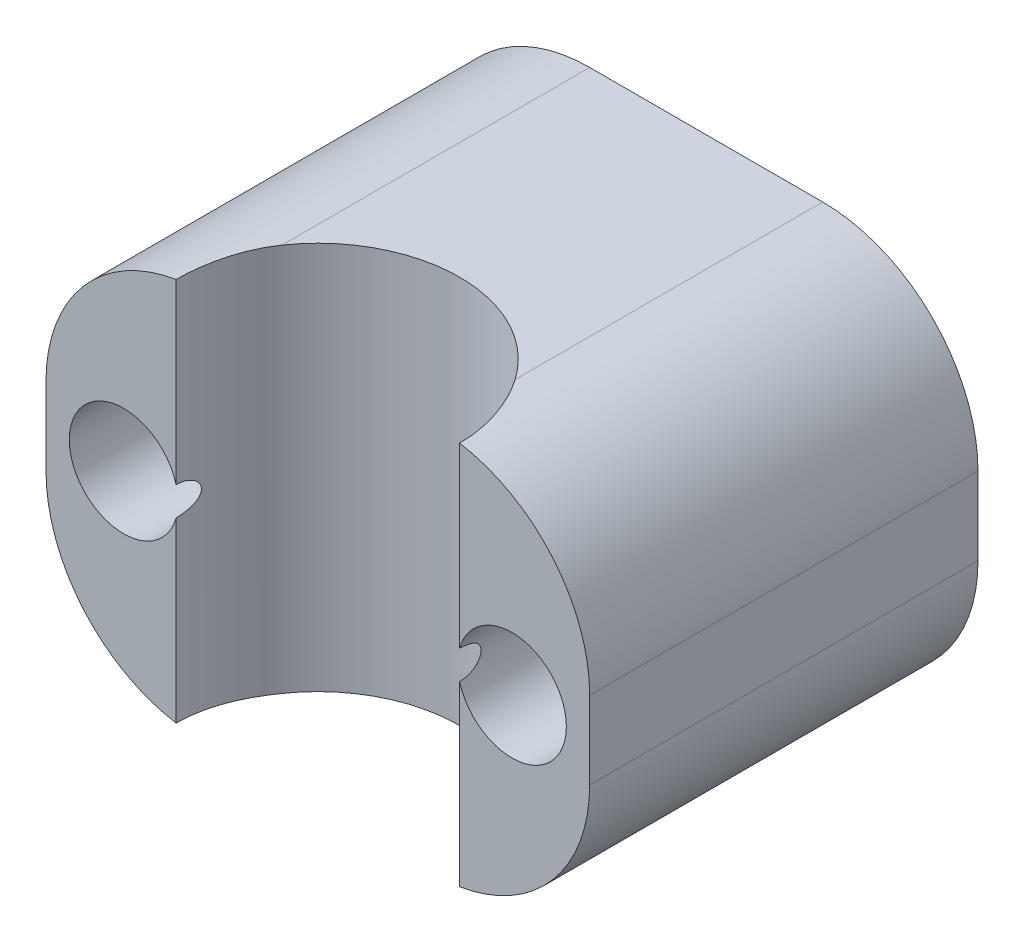
ISO-10303-21;
HEADER;
FILE_DESCRIPTION(('STEP AP214'),'2;1');
FILE_NAME('part.step','',(''),(''),'','','');
FILE_SCHEMA(('AUTOMOTIVE_DESIGN { 1 0 10303 214 1 1 1 1 }'));
ENDSEC;
DATA;
#1=APPLICATION_CONTEXT('core data for automotive mechanical design processes');
#2=APPLICATION_PROTOCOL_DEFINITION('international standard','automotive_design',2000,#1);
#3=PRODUCT_CONTEXT('',#1,'mechanical');
#4=PRODUCT('Part','Part','',(#3));
#5=PRODUCT_RELATED_PRODUCT_CATEGORY('part','',(#4));
#6=PRODUCT_DEFINITION_FORMATION('','',#4);
#7=PRODUCT_DEFINITION_CONTEXT('part definition',#1,'design');
#8=PRODUCT_DEFINITION('design','',#6,#7);
#9=PRODUCT_DEFINITION_SHAPE('','',#8);
#10=(LENGTH_UNIT() NAMED_UNIT(*) SI_UNIT(.MILLI.,.METRE.));
#11=(NAMED_UNIT(*) PLANE_ANGLE_UNIT() SI_UNIT($,.RADIAN.));
#12=(NAMED_UNIT(*) SI_UNIT($,.STERADIAN.) SOLID_ANGLE_UNIT());
#13=UNCERTAINTY_MEASURE_WITH_UNIT(LENGTH_MEASURE(1.E-05),#10,'distance_accuracy_value','');
#14=(GEOMETRIC_REPRESENTATION_CONTEXT(3) GLOBAL_UNCERTAINTY_ASSIGNED_CONTEXT((#13)) GLOBAL_UNIT_ASSIGNED_CONTEXT((#10,
#11,#12)) REPRESENTATION_CONTEXT('',''));
#15=CARTESIAN_POINT('',(0.,0.,0.));
#16=DIRECTION('',(0.,0.,1.));
#17=DIRECTION('',(1.,0.,0.));
#18=AXIS2_PLACEMENT_3D('',#15,#16,#17);
#19=CARTESIAN_POINT('',(3.,-0.999999999999999,10.));
#20=DIRECTION('',(0.,0.,1.));
#21=DIRECTION('',(1.,0.,0.));
#22=AXIS2_PLACEMENT_3D('',#19,#20,#21);
#23=PLANE('',#22);
#24=CARTESIAN_POINT('',(5.,0.,10.));
#25=DIRECTION('',(0.,0.,1.));
#26=DIRECTION('',(1.,0.,0.));
#27=AXIS2_PLACEMENT_3D('',#24,#25,#26);
#28=CIRCLE('',#27,1.4);
#29=CARTESIAN_POINT('',(3.65,-0.370809924354783,10.));
#30=VERTEX_POINT('',#29);
#31=CARTESIAN_POINT('',(3.65,0.370809924354787,10.));
#32=VERTEX_POINT('',#31);
#33=EDGE_CURVE('E47',#30,#32,#28,.T.);
#34=ORIENTED_EDGE('',*,*,#33,.F.);
#35=DIRECTION('',(0.,1.,0.));
#36=VECTOR('',#35,1.);
#37=CARTESIAN_POINT('',(3.65,-5.001,10.));
#38=LINE('',#37,#36);
#39=CARTESIAN_POINT('',(3.65,-4.94683417437318,10.));
#40=VERTEX_POINT('',#39);
#41=EDGE_CURVE('E140',#30,#40,#38,.F.);
#42=ORIENTED_EDGE('',*,*,#41,.T.);
#43=CARTESIAN_POINT('',(3.,-0.999999999999999,10.));
#44=DIRECTION('',(0.,0.,1.));
#45=DIRECTION('',(1.,0.,0.));
#46=AXIS2_PLACEMENT_3D('',#43,#44,#45);
#47=CIRCLE('',#46,4.);
#48=CARTESIAN_POINT('',(7.,-0.999999999999999,10.));
#49=VERTEX_POINT('',#48);
#50=EDGE_CURVE('E184',#40,#49,#47,.T.);
#51=ORIENTED_EDGE('',*,*,#50,.T.);
#52=DIRECTION('',(0.,1.,0.));
#53=VECTOR('',#52,1.);
#54=CARTESIAN_POINT('',(7.,1.,10.));
#55=LINE('',#54,#53);
#56=CARTESIAN_POINT('',(7.,1.,10.));
#57=VERTEX_POINT('',#56);
#58=EDGE_CURVE('E186',#49,#57,#55,.T.);
#59=ORIENTED_EDGE('',*,*,#58,.T.);
#60=CARTESIAN_POINT('',(3.,1.,10.));
#61=DIRECTION('',(0.,0.,1.));
#62=DIRECTION('',(-1.,0.,0.));
#63=AXIS2_PLACEMENT_3D('',#60,#61,#62);
#64=CIRCLE('',#63,4.);
#65=CARTESIAN_POINT('',(3.65,4.94683417437318,10.));
#66=VERTEX_POINT('',#65);
#67=EDGE_CURVE('E189',#57,#66,#64,.T.);
#68=ORIENTED_EDGE('',*,*,#67,.T.);
#69=EDGE_CURVE('E146',#66,#32,#38,.F.);
#70=ORIENTED_EDGE('',*,*,#69,.T.);
#71=EDGE_LOOP('',(#34,#42,#51,#59,#68,#70));
#72=FACE_BOUND('',#71,.T.);
#73=ADVANCED_FACE('F33',(#72),#23,.T.);
#74=CARTESIAN_POINT('',(3.,-0.999999999999999,10.));
#75=DIRECTION('',(0.,0.,-1.));
#76=DIRECTION('',(-1.,0.,0.));
#77=AXIS2_PLACEMENT_3D('',#74,#75,#76);
#78=CYLINDRICAL_SURFACE('',#77,4.);
#79=ORIENTED_EDGE('',*,*,#50,.F.);
#80=CARTESIAN_POINT('',(3.,-5.,7.92093771137082));
#81=CARTESIAN_POINT('',(3.05905614962708,-4.99998590221366,8.00613249850465));
#82=CARTESIAN_POINT('',(3.11445377091346,-4.99869143231913,8.09384145310506));
#83=CARTESIAN_POINT('',(3.217577286826,-4.99441530970738,8.27361361424878));
#84=CARTESIAN_POINT('',(3.26530379211801,-4.99143379137462,8.36567647343987));
#85=CARTESIAN_POINT('',(3.35165363879588,-4.98474104788839,8.55116271649373));
#86=CARTESIAN_POINT('',(3.39047370499135,-4.98104979493619,8.64449545508971));
#87=CARTESIAN_POINT('',(3.46023776477938,-4.97358973161619,8.83404616543743));
#88=CARTESIAN_POINT('',(3.49118300508242,-4.96982093362724,8.930263677784));
#89=CARTESIAN_POINT('',(3.53971247846784,-4.96348127563908,9.10583715892558));
#90=CARTESIAN_POINT('',(3.55872688830118,-4.96082045033227,9.18479809180945));
#91=CARTESIAN_POINT('',(3.59145062058653,-4.95606603985459,9.34382106297566));
#92=CARTESIAN_POINT('',(3.60516066552437,-4.95397237744445,9.42388294976217));
#93=CARTESIAN_POINT('',(3.62743675264427,-4.95050129027259,9.58640131586605));
#94=CARTESIAN_POINT('',(3.63589208443823,-4.94913935749735,9.66887331603807));
#95=CARTESIAN_POINT('',(3.64717686274494,-4.94729870459661,9.83422959665278));
#96=CARTESIAN_POINT('',(3.65000503629541,-4.94682018431634,9.91711396613044));
#97=CARTESIAN_POINT('',(3.65,-4.94683417437318,10.));
#98=B_SPLINE_CURVE_WITH_KNOTS('',3,(#80,#81,#82,#83,#84,#85,#86,#87,#88,#89,#90,#91,#92,#93,#94,
#95,#96,#97),.UNSPECIFIED.,.F.,.F.,(4,2,2,2,2,2,2,2,4),(0.,0.310860241223388,0.621695723878272,
0.924807712383898,1.22787168353305,1.47148275049163,1.7150606244922,1.9636103552711,
2.21221630598534),.UNSPECIFIED.);
#99=CARTESIAN_POINT('',(3.,-5.,7.92093771137082));
#100=VERTEX_POINT('',#99);
#101=EDGE_CURVE('E173',#100,#40,#98,.T.);
#102=ORIENTED_EDGE('',*,*,#101,.F.);
#103=DIRECTION('',(0.,0.,-1.));
#104=VECTOR('',#103,1.);
#105=CARTESIAN_POINT('',(3.,-5.,10.));
#106=LINE('',#105,#104);
#107=CARTESIAN_POINT('',(3.,-5.,0.));
#108=VERTEX_POINT('',#107);
#109=EDGE_CURVE('E198',#100,#108,#106,.T.);
#110=ORIENTED_EDGE('',*,*,#109,.T.);
#111=CARTESIAN_POINT('',(3.,-0.999999999999999,0.));
#112=DIRECTION('',(0.,0.,1.));
#113=DIRECTION('',(1.,0.,0.));
#114=AXIS2_PLACEMENT_3D('',#111,#112,#113);
#115=CIRCLE('',#114,4.);
#116=CARTESIAN_POINT('',(7.,-0.999999999999999,0.));
#117=VERTEX_POINT('',#116);
#118=EDGE_CURVE('E181',#108,#117,#115,.T.);
#119=ORIENTED_EDGE('',*,*,#118,.T.);
#120=DIRECTION('',(0.,0.,-1.));
#121=VECTOR('',#120,1.);
#122=CARTESIAN_POINT('',(7.,-0.999999999999999,10.));
#123=LINE('',#122,#121);
#124=EDGE_CURVE('E11',#49,#117,#123,.T.);
#125=ORIENTED_EDGE('',*,*,#124,.F.);
#126=EDGE_LOOP('',(#79,#102,#110,#119,#125));
#127=FACE_BOUND('',#126,.T.);
#128=ADVANCED_FACE('F35',(#127),#78,.T.);
#129=CARTESIAN_POINT('',(7.,1.,10.));
#130=DIRECTION('',(-1.,0.,0.));
#131=DIRECTION('',(0.,0.,1.));
#132=AXIS2_PLACEMENT_3D('',#129,#130,#131);
#133=PLANE('',#132);
#134=DIRECTION('',(0.,1.,0.));
#135=VECTOR('',#134,1.);
#136=CARTESIAN_POINT('',(7.,1.,0.));
#137=LINE('',#136,#135);
#138=CARTESIAN_POINT('',(7.,1.,0.));
#139=VERTEX_POINT('',#138);
#140=EDGE_CURVE('E201',#117,#139,#137,.T.);
#141=ORIENTED_EDGE('',*,*,#140,.T.);
#142=DIRECTION('',(0.,0.,-1.));
#143=VECTOR('',#142,1.);
#144=CARTESIAN_POINT('',(7.,1.,10.));
#145=LINE('',#144,#143);
#146=EDGE_CURVE('E41',#57,#139,#145,.T.);
#147=ORIENTED_EDGE('',*,*,#146,.F.);
#148=ORIENTED_EDGE('',*,*,#58,.F.);
#149=ORIENTED_EDGE('',*,*,#124,.T.);
#150=EDGE_LOOP('',(#141,#147,#148,#149));
#151=FACE_BOUND('',#150,.T.);
#152=ADVANCED_FACE('F254',(#151),#133,.F.);
#153=CARTESIAN_POINT('',(3.,1.,10.));
#154=DIRECTION('',(0.,0.,-1.));
#155=DIRECTION('',(-1.,0.,0.));
#156=AXIS2_PLACEMENT_3D('',#153,#154,#155);
#157=CYLINDRICAL_SURFACE('',#156,4.);
#158=DIRECTION('',(0.,0.,-1.));
#159=VECTOR('',#158,1.);
#160=CARTESIAN_POINT('',(3.,5.,10.));
#161=LINE('',#160,#159);
#162=CARTESIAN_POINT('',(3.,5.,7.92093771137082));
#163=VERTEX_POINT('',#162);
#164=CARTESIAN_POINT('',(3.,5.,0.));
#165=VERTEX_POINT('',#164);
#166=EDGE_CURVE('E229',#163,#165,#161,.T.);
#167=ORIENTED_EDGE('',*,*,#166,.F.);
#168=CARTESIAN_POINT('',(3.65,4.94683417437318,10.));
#169=CARTESIAN_POINT('',(3.65001149307545,4.94680039843344,9.89629118581616));
#170=CARTESIAN_POINT('',(3.6455801855096,4.94756117960404,9.79258915088072));
#171=CARTESIAN_POINT('',(3.62791967941891,4.9504257845458,9.58596115882356));
#172=CARTESIAN_POINT('',(3.61469101588359,4.95252952664778,9.48303515489434));
#173=CARTESIAN_POINT('',(3.57995927449505,4.95776830554319,9.281240900948));
#174=CARTESIAN_POINT('',(3.55866939038773,4.96087649114836,9.182335304927));
#175=CARTESIAN_POINT('',(3.50797901199628,4.96769596494514,8.98668671751548));
#176=CARTESIAN_POINT('',(3.47857973547122,4.97140716255019,8.88994340377873));
#177=CARTESIAN_POINT('',(3.39163438290355,4.98114952363938,8.64148266725141));
#178=CARTESIAN_POINT('',(3.32781699127362,4.9872268619832,8.49188815799929));
#179=CARTESIAN_POINT('',(3.21689120655757,4.99429035551251,8.27344656372807));
#180=CARTESIAN_POINT('',(3.17689705748746,4.99631241481261,8.20092086026241));
#181=CARTESIAN_POINT('',(3.09204983560424,4.99916553007525,8.05871754655031));
#182=CARTESIAN_POINT('',(3.04719533596757,4.99999623527487,7.98904078096244));
#183=CARTESIAN_POINT('',(3.,5.,7.92093771137082));
#184=B_SPLINE_CURVE_WITH_KNOTS('',3,(#168,#169,#170,#171,#172,#173,#174,#175,#176,#177,#178,
#179,#180,#181,#182,#183),.UNSPECIFIED.,.F.,.F.,(4,2,2,2,2,2,2,4),(0.,0.311017870391577,
0.622016828727295,0.92530816303992,1.22855397792626,1.71512556766894,1.96349912819243,
2.21194580078801),.UNSPECIFIED.);
#185=EDGE_CURVE('E156',#66,#163,#184,.T.);
#186=ORIENTED_EDGE('',*,*,#185,.F.);
#187=ORIENTED_EDGE('',*,*,#67,.F.);
#188=ORIENTED_EDGE('',*,*,#146,.T.);
#189=CARTESIAN_POINT('',(3.,1.,0.));
#190=DIRECTION('',(0.,0.,1.));
#191=DIRECTION('',(-1.,0.,0.));
#192=AXIS2_PLACEMENT_3D('',#189,#190,#191);
#193=CIRCLE('',#192,4.);
#194=EDGE_CURVE('E203',#139,#165,#193,.T.);
#195=ORIENTED_EDGE('',*,*,#194,.T.);
#196=EDGE_LOOP('',(#167,#186,#187,#188,#195));
#197=FACE_BOUND('',#196,.T.);
#198=ADVANCED_FACE('F236',(#197),#157,.T.);
#199=CARTESIAN_POINT('',(-3.,5.,10.));
#200=DIRECTION('',(0.,-1.,0.));
#201=DIRECTION('',(0.,0.,-1.));
#202=AXIS2_PLACEMENT_3D('',#199,#200,#201);
#203=PLANE('',#202);
#204=DIRECTION('',(0.,0.,-1.));
#205=VECTOR('',#204,1.);
#206=CARTESIAN_POINT('',(-3.,5.,10.));
#207=LINE('',#206,#205);
#208=CARTESIAN_POINT('',(-3.,5.,7.92093771137082));
#209=VERTEX_POINT('',#208);
#210=CARTESIAN_POINT('',(-3.,5.,0.));
#211=VERTEX_POINT('',#210);
#212=EDGE_CURVE('E227',#209,#211,#207,.T.);
#213=ORIENTED_EDGE('',*,*,#212,.F.);
#214=CARTESIAN_POINT('',(0.,5.,10.));
#215=DIRECTION('',(0.,1.,0.));
#216=DIRECTION('',(0.,0.,1.));
#217=AXIS2_PLACEMENT_3D('',#214,#215,#216);
#218=CIRCLE('',#217,3.65);
#219=EDGE_CURVE('E250',#163,#209,#218,.T.);
#220=ORIENTED_EDGE('',*,*,#219,.F.);
#221=ORIENTED_EDGE('',*,*,#166,.T.);
#222=DIRECTION('',(-1.,0.,0.));
#223=VECTOR('',#222,1.);
#224=CARTESIAN_POINT('',(-3.,5.,0.));
#225=LINE('',#224,#223);
#226=EDGE_CURVE('E206',#165,#211,#225,.T.);
#227=ORIENTED_EDGE('',*,*,#226,.T.);
#228=EDGE_LOOP('',(#213,#220,#221,#227));
#229=FACE_BOUND('',#228,.T.);
#230=ADVANCED_FACE('F248',(#229),#203,.F.);
#231=CARTESIAN_POINT('',(-3.,1.,10.));
#232=DIRECTION('',(0.,0.,-1.));
#233=DIRECTION('',(-1.,0.,0.));
#234=AXIS2_PLACEMENT_3D('',#231,#232,#233);
#235=CYLINDRICAL_SURFACE('',#234,4.);
#236=CARTESIAN_POINT('',(-3.,1.,10.));
#237=DIRECTION('',(0.,0.,1.));
#238=DIRECTION('',(1.,0.,0.));
#239=AXIS2_PLACEMENT_3D('',#236,#237,#238);
#240=CIRCLE('',#239,4.);
#241=CARTESIAN_POINT('',(-3.65,4.94683417437318,10.));
#242=VERTEX_POINT('',#241);
#243=CARTESIAN_POINT('',(-7.,1.,10.));
#244=VERTEX_POINT('',#243);
#245=EDGE_CURVE('E192',#242,#244,#240,.T.);
#246=ORIENTED_EDGE('',*,*,#245,.F.);
#247=CARTESIAN_POINT('',(-3.,5.,7.92093771137082));
#248=CARTESIAN_POINT('',(-3.05905614962708,4.99998590221366,8.00613249850465));
#249=CARTESIAN_POINT('',(-3.11445377091346,4.99869143231913,8.09384145310506));
#250=CARTESIAN_POINT('',(-3.217577286826,4.99441530970739,8.27361361424878));
#251=CARTESIAN_POINT('',(-3.26530379211801,4.99143379137462,8.36567647343986));
#252=CARTESIAN_POINT('',(-3.35165363879588,4.98474104788839,8.55116271649373));
#253=CARTESIAN_POINT('',(-3.39047370499135,4.98104979493619,8.6444954550897));
#254=CARTESIAN_POINT('',(-3.46023776477938,4.97358973161619,8.83404616543743));
#255=CARTESIAN_POINT('',(-3.49118300508242,4.96982093362724,8.930263677784));
#256=CARTESIAN_POINT('',(-3.53971247846784,4.96348127563909,9.10583715892557));
#257=CARTESIAN_POINT('',(-3.55872688830118,4.96082045033227,9.18479809180945));
#258=CARTESIAN_POINT('',(-3.59145062058653,4.95606603985459,9.34382106297566));
#259=CARTESIAN_POINT('',(-3.60516066552437,4.95397237744445,9.42388294976217));
#260=CARTESIAN_POINT('',(-3.62743675264427,4.9505012902726,9.58640131586605));
#261=CARTESIAN_POINT('',(-3.63589208443823,4.94913935749735,9.66887331603806));
#262=CARTESIAN_POINT('',(-3.64717686274494,4.94729870459661,9.83422959665278));
#263=CARTESIAN_POINT('',(-3.65000503629541,4.94682018431635,9.91711396613044));
#264=CARTESIAN_POINT('',(-3.65,4.94683417437318,10.));
#265=B_SPLINE_CURVE_WITH_KNOTS('',3,(#247,#248,#249,#250,#251,#252,#253,#254,#255,#256,#257,
#258,#259,#260,#261,#262,#263,#264),.UNSPECIFIED.,.F.,.F.,(4,2,2,2,2,2,2,2,4),(0.,
0.310860241223388,0.62169572387827,0.924807712383896,1.22787168353305,1.47148275049163,
1.7150606244922,1.9636103552711,2.21221630598534),.UNSPECIFIED.);
#266=EDGE_CURVE('E137',#209,#242,#265,.T.);
#267=ORIENTED_EDGE('',*,*,#266,.F.);
#268=ORIENTED_EDGE('',*,*,#212,.T.);
#269=CARTESIAN_POINT('',(-3.,1.,0.));
#270=DIRECTION('',(0.,0.,1.));
#271=DIRECTION('',(1.,0.,0.));
#272=AXIS2_PLACEMENT_3D('',#269,#270,#271);
#273=CIRCLE('',#272,4.);
#274=CARTESIAN_POINT('',(-7.,1.,0.));
#275=VERTEX_POINT('',#274);
#276=EDGE_CURVE('E209',#211,#275,#273,.T.);
#277=ORIENTED_EDGE('',*,*,#276,.T.);
#278=DIRECTION('',(0.,0.,-1.));
#279=VECTOR('',#278,1.);
#280=CARTESIAN_POINT('',(-7.,1.,10.));
#281=LINE('',#280,#279);
#282=EDGE_CURVE('E224',#244,#275,#281,.T.);
#283=ORIENTED_EDGE('',*,*,#282,.F.);
#284=EDGE_LOOP('',(#246,#267,#268,#277,#283));
#285=FACE_BOUND('',#284,.T.);
#286=ADVANCED_FACE('F274',(#285),#235,.T.);
#287=CARTESIAN_POINT('',(-7.,1.,10.));
#288=DIRECTION('',(1.,0.,0.));
#289=DIRECTION('',(0.,1.,0.));
#290=AXIS2_PLACEMENT_3D('',#287,#288,#289);
#291=PLANE('',#290);
#292=DIRECTION('',(0.,-1.,0.));
#293=VECTOR('',#292,1.);
#294=CARTESIAN_POINT('',(-7.,1.,0.));
#295=LINE('',#294,#293);
#296=CARTESIAN_POINT('',(-7.,-0.999999999999999,0.));
#297=VERTEX_POINT('',#296);
#298=EDGE_CURVE('E211',#275,#297,#295,.T.);
#299=ORIENTED_EDGE('',*,*,#298,.T.);
#300=DIRECTION('',(0.,0.,-1.));
#301=VECTOR('',#300,1.);
#302=CARTESIAN_POINT('',(-7.,-0.999999999999999,10.));
#303=LINE('',#302,#301);
#304=CARTESIAN_POINT('',(-7.,-0.999999999999999,10.));
#305=VERTEX_POINT('',#304);
#306=EDGE_CURVE('E221',#305,#297,#303,.T.);
#307=ORIENTED_EDGE('',*,*,#306,.F.);
#308=DIRECTION('',(0.,-1.,0.));
#309=VECTOR('',#308,1.);
#310=CARTESIAN_POINT('',(-7.,1.,10.));
#311=LINE('',#310,#309);
#312=EDGE_CURVE('E194',#244,#305,#311,.T.);
#313=ORIENTED_EDGE('',*,*,#312,.F.);
#314=ORIENTED_EDGE('',*,*,#282,.T.);
#315=EDGE_LOOP('',(#299,#307,#313,#314));
#316=FACE_BOUND('',#315,.T.);
#317=ADVANCED_FACE('F271',(#316),#291,.F.);
#318=CARTESIAN_POINT('',(-3.,-0.999999999999999,10.));
#319=DIRECTION('',(0.,0.,-1.));
#320=DIRECTION('',(-1.,0.,0.));
#321=AXIS2_PLACEMENT_3D('',#318,#319,#320);
#322=CYLINDRICAL_SURFACE('',#321,4.);
#323=DIRECTION('',(0.,0.,-1.));
#324=VECTOR('',#323,1.);
#325=CARTESIAN_POINT('',(-3.,-5.,10.));
#326=LINE('',#325,#324);
#327=CARTESIAN_POINT('',(-3.,-5.,7.92093771137082));
#328=VERTEX_POINT('',#327);
#329=CARTESIAN_POINT('',(-3.,-5.,0.));
#330=VERTEX_POINT('',#329);
#331=EDGE_CURVE('E219',#328,#330,#326,.T.);
#332=ORIENTED_EDGE('',*,*,#331,.F.);
#333=CARTESIAN_POINT('',(-3.65,-4.94683417437318,10.));
#334=CARTESIAN_POINT('',(-3.65001149307545,-4.94680039843344,9.89629118581616));
#335=CARTESIAN_POINT('',(-3.6455801855096,-4.94756117960404,9.79258915088072));
#336=CARTESIAN_POINT('',(-3.62791967941891,-4.9504257845458,9.58596115882356));
#337=CARTESIAN_POINT('',(-3.61469101588359,-4.95252952664778,9.48303515489434));
#338=CARTESIAN_POINT('',(-3.57995927449505,-4.95776830554319,9.281240900948));
#339=CARTESIAN_POINT('',(-3.55866939038773,-4.96087649114836,9.182335304927));
#340=CARTESIAN_POINT('',(-3.50797901199628,-4.96769596494513,8.98668671751548));
#341=CARTESIAN_POINT('',(-3.47857973547122,-4.97140716255019,8.88994340377873));
#342=CARTESIAN_POINT('',(-3.39163438290355,-4.98114952363938,8.64148266725141));
#343=CARTESIAN_POINT('',(-3.32781699127362,-4.9872268619832,8.49188815799929));
#344=CARTESIAN_POINT('',(-3.21689120655757,-4.99429035551251,8.27344656372807));
#345=CARTESIAN_POINT('',(-3.17689705748746,-4.99631241481261,8.20092086026241));
#346=CARTESIAN_POINT('',(-3.09204983560424,-4.99916553007525,8.05871754655031));
#347=CARTESIAN_POINT('',(-3.04719533596757,-4.99999623527486,7.98904078096244));
#348=CARTESIAN_POINT('',(-3.,-5.,7.92093771137082));
#349=B_SPLINE_CURVE_WITH_KNOTS('',3,(#333,#334,#335,#336,#337,#338,#339,#340,#341,#342,#343,
#344,#345,#346,#347,#348),.UNSPECIFIED.,.F.,.F.,(4,2,2,2,2,2,2,4),(0.,0.311017870391577,
0.622016828727295,0.92530816303992,1.22855397792626,1.71512556766894,1.96349912819243,
2.21194580078801),.UNSPECIFIED.);
#350=CARTESIAN_POINT('',(-3.65,-4.94683417437318,10.));
#351=VERTEX_POINT('',#350);
#352=EDGE_CURVE('E404',#351,#328,#349,.T.);
#353=ORIENTED_EDGE('',*,*,#352,.F.);
#354=CARTESIAN_POINT('',(-3.,-0.999999999999999,10.));
#355=DIRECTION('',(0.,0.,1.));
#356=DIRECTION('',(1.,0.,0.));
#357=AXIS2_PLACEMENT_3D('',#354,#355,#356);
#358=CIRCLE('',#357,4.);
#359=EDGE_CURVE('E196',#305,#351,#358,.T.);
#360=ORIENTED_EDGE('',*,*,#359,.F.);
#361=ORIENTED_EDGE('',*,*,#306,.T.);
#362=CARTESIAN_POINT('',(-3.,-0.999999999999999,0.));
#363=DIRECTION('',(0.,0.,1.));
#364=DIRECTION('',(1.,0.,0.));
#365=AXIS2_PLACEMENT_3D('',#362,#363,#364);
#366=CIRCLE('',#365,4.);
#367=EDGE_CURVE('E213',#297,#330,#366,.T.);
#368=ORIENTED_EDGE('',*,*,#367,.T.);
#369=EDGE_LOOP('',(#332,#353,#360,#361,#368));
#370=FACE_BOUND('',#369,.T.);
#371=ADVANCED_FACE('F266',(#370),#322,.T.);
#372=CARTESIAN_POINT('',(-3.,-5.,10.));
#373=DIRECTION('',(0.,1.,0.));
#374=DIRECTION('',(-1.,0.,0.));
#375=AXIS2_PLACEMENT_3D('',#372,#373,#374);
#376=PLANE('',#375);
#377=ORIENTED_EDGE('',*,*,#109,.F.);
#378=CARTESIAN_POINT('',(0.,-5.,10.));
#379=DIRECTION('',(0.,1.,0.));
#380=DIRECTION('',(-1.,0.,0.));
#381=AXIS2_PLACEMENT_3D('',#378,#379,#380);
#382=CIRCLE('',#381,3.65);
#383=EDGE_CURVE('E182',#328,#100,#382,.F.);
#384=ORIENTED_EDGE('',*,*,#383,.F.);
#385=ORIENTED_EDGE('',*,*,#331,.T.);
#386=DIRECTION('',(1.,0.,0.));
#387=VECTOR('',#386,1.);
#388=CARTESIAN_POINT('',(-3.,-5.,0.));
#389=LINE('',#388,#387);
#390=EDGE_CURVE('E187',#330,#108,#389,.T.);
#391=ORIENTED_EDGE('',*,*,#390,.T.);
#392=EDGE_LOOP('',(#377,#384,#385,#391));
#393=FACE_BOUND('',#392,.T.);
#394=ADVANCED_FACE('F261',(#393),#376,.F.);
#395=CARTESIAN_POINT('',(-5.,0.,10.));
#396=DIRECTION('',(0.,0.,1.));
#397=DIRECTION('',(1.,0.,0.));
#398=AXIS2_PLACEMENT_3D('',#395,#396,#397);
#399=CIRCLE('',#398,1.4);
#400=CARTESIAN_POINT('',(-3.65,0.370809924354785,10.));
#401=VERTEX_POINT('',#400);
#402=CARTESIAN_POINT('',(-3.65,-0.370809924354785,10.));
#403=VERTEX_POINT('',#402);
#404=EDGE_CURVE('E54',#401,#403,#399,.T.);
#405=ORIENTED_EDGE('',*,*,#404,.F.);
#406=DIRECTION('',(0.,1.,0.));
#407=VECTOR('',#406,1.);
#408=CARTESIAN_POINT('',(-3.65,-5.001,10.));
#409=LINE('',#408,#407);
#410=EDGE_CURVE('E129',#401,#242,#409,.T.);
#411=ORIENTED_EDGE('',*,*,#410,.T.);
#412=ORIENTED_EDGE('',*,*,#245,.T.);
#413=ORIENTED_EDGE('',*,*,#312,.T.);
#414=ORIENTED_EDGE('',*,*,#359,.T.);
#415=EDGE_CURVE('E132',#351,#403,#409,.T.);
#416=ORIENTED_EDGE('',*,*,#415,.T.);
#417=EDGE_LOOP('',(#405,#411,#412,#413,#414,#416));
#418=FACE_BOUND('',#417,.T.);
#419=ADVANCED_FACE('F128',(#418),#23,.T.);
#420=CARTESIAN_POINT('',(3.,-0.999999999999999,0.));
#421=DIRECTION('',(0.,0.,1.));
#422=DIRECTION('',(1.,0.,0.));
#423=AXIS2_PLACEMENT_3D('',#420,#421,#422);
#424=PLANE('',#423);
#425=CARTESIAN_POINT('',(-5.,0.,0.));
#426=DIRECTION('',(0.,0.,1.));
#427=DIRECTION('',(1.,0.,0.));
#428=AXIS2_PLACEMENT_3D('',#425,#426,#427);
#429=CIRCLE('',#428,1.4);
#430=CARTESIAN_POINT('',(-3.6,0.,0.));
#431=VERTEX_POINT('',#430);
#432=EDGE_CURVE('E133',#431,#431,#429,.F.);
#433=ORIENTED_EDGE('',*,*,#432,.F.);
#434=EDGE_LOOP('',(#433));
#435=FACE_BOUND('',#434,.T.);
#436=CARTESIAN_POINT('',(5.,0.,0.));
#437=DIRECTION('',(0.,0.,1.));
#438=DIRECTION('',(1.,0.,0.));
#439=AXIS2_PLACEMENT_3D('',#436,#437,#438);
#440=CIRCLE('',#439,1.4);
#441=CARTESIAN_POINT('',(6.4,0.,0.));
#442=VERTEX_POINT('',#441);
#443=EDGE_CURVE('E125',#442,#442,#440,.F.);
#444=ORIENTED_EDGE('',*,*,#443,.F.);
#445=EDGE_LOOP('',(#444));
#446=FACE_BOUND('',#445,.T.);
#447=ORIENTED_EDGE('',*,*,#118,.F.);
#448=ORIENTED_EDGE('',*,*,#390,.F.);
#449=ORIENTED_EDGE('',*,*,#367,.F.);
#450=ORIENTED_EDGE('',*,*,#298,.F.);
#451=ORIENTED_EDGE('',*,*,#276,.F.);
#452=ORIENTED_EDGE('',*,*,#226,.F.);
#453=ORIENTED_EDGE('',*,*,#194,.F.);
#454=ORIENTED_EDGE('',*,*,#140,.F.);
#455=EDGE_LOOP('',(#447,#448,#449,#450,#451,#452,#453,#454));
#456=FACE_BOUND('',#455,.T.);
#457=ADVANCED_FACE('F243',(#435,#446,#456),#424,.F.);
#458=CARTESIAN_POINT('',(0.,-5.001,10.));
#459=DIRECTION('',(0.,1.,0.));
#460=DIRECTION('',(0.,0.,1.));
#461=AXIS2_PLACEMENT_3D('',#458,#459,#460);
#462=CYLINDRICAL_SURFACE('',#461,3.65);
#463=ORIENTED_EDGE('',*,*,#410,.F.);
#464=CARTESIAN_POINT('',(-3.65,-0.370809924354785,10.));
#465=CARTESIAN_POINT('',(-3.65000014823116,-0.370802684490196,9.9760349925443));
#466=CARTESIAN_POINT('',(-3.64976341506126,-0.369951277577179,9.95208562146983));
#467=CARTESIAN_POINT('',(-3.64882340345008,-0.366504304431454,9.9042813027833));
#468=CARTESIAN_POINT('',(-3.64811932468423,-0.363905746120854,9.88042658788765));
#469=CARTESIAN_POINT('',(-3.64529791861325,-0.353333669598107,9.80870837043007));
#470=CARTESIAN_POINT('',(-3.64247164250711,-0.342581114477204,9.76121623837463));
#471=CARTESIAN_POINT('',(-3.63661301091074,-0.318220349001445,9.68632344864094));
#472=CARTESIAN_POINT('',(-3.63405102371682,-0.307174623602604,9.65803808443933));
#473=CARTESIAN_POINT('',(-3.62848644414617,-0.281297012856198,9.60334863120393));
#474=CARTESIAN_POINT('',(-3.62548542446457,-0.266478507576115,9.57693830716662));
#475=CARTESIAN_POINT('',(-3.62024051025285,-0.237507666076656,9.53451863535096));
#476=CARTESIAN_POINT('',(-3.6180365007732,-0.224464875104511,9.51775000261192));
#477=CARTESIAN_POINT('',(-3.61371151261313,-0.19598837979677,9.4863480560173));
#478=CARTESIAN_POINT('',(-3.61159041786038,-0.180558179584541,9.47171167272028));
#479=CARTESIAN_POINT('',(-3.60817423721737,-0.151572826562113,9.44893228226566));
#480=CARTESIAN_POINT('',(-3.60680799954639,-0.138578206826215,9.44009132670541));
#481=CARTESIAN_POINT('',(-3.60436549747834,-0.111315244995582,9.42457753359751));
#482=CARTESIAN_POINT('',(-3.60328904008862,-0.0970477590984544,9.41790325243938));
#483=CARTESIAN_POINT('',(-3.60154093092378,-0.0673435968756591,9.40718181195745));
#484=CARTESIAN_POINT('',(-3.60087362871774,-0.0518962568892742,9.40316284655006));
#485=CARTESIAN_POINT('',(-3.60006243985965,-0.020499255922551,9.39828814117958));
#486=CARTESIAN_POINT('',(-3.59991795388435,-0.00455019126580203,9.39742877923005));
#487=CARTESIAN_POINT('',(-3.60015368299185,0.0247199430681502,9.39884007561974));
#488=CARTESIAN_POINT('',(-3.60045629570402,0.0380664017948633,9.40064774867176));
#489=CARTESIAN_POINT('',(-3.60141429341325,0.0642654119684866,9.40643145848223));
#490=CARTESIAN_POINT('',(-3.60206982722077,0.0771177526176783,9.41040840993419));
#491=CARTESIAN_POINT('',(-3.60385633285973,0.10498129957488,9.42141807009216));
#492=CARTESIAN_POINT('',(-3.605062853915,0.119789531418463,9.42894941872744));
#493=CARTESIAN_POINT('',(-3.60776853497844,0.147962474099445,9.4463002284163));
#494=CARTESIAN_POINT('',(-3.60926816310365,0.161324821989137,9.45612335455952));
#495=CARTESIAN_POINT('',(-3.61309420625511,0.19188733743005,9.48203797273708));
#496=CARTESIAN_POINT('',(-3.61550179897321,0.208316172085522,9.49902229535716));
#497=CARTESIAN_POINT('',(-3.62034845946745,0.238311418883309,9.53533229842086));
#498=CARTESIAN_POINT('',(-3.62278758113293,0.251871963882245,9.55466265308191));
#499=CARTESIAN_POINT('',(-3.62882049572348,0.283285671683122,9.6061101724765));
#500=CARTESIAN_POINT('',(-3.63229994184523,0.299317392882767,9.63934809088881));
#501=CARTESIAN_POINT('',(-3.63846279017437,0.326193522416272,9.70795797533886));
#502=CARTESIAN_POINT('',(-3.64114355817045,0.337020835964368,9.74333655012037));
#503=CARTESIAN_POINT('',(-3.64551492964453,0.354193972158406,9.81551940234736));
#504=CARTESIAN_POINT('',(-3.6471969774998,0.36050116518595,9.8523331987181));
#505=CARTESIAN_POINT('',(-3.64944025375615,0.368765666114188,9.92611598688259));
#506=CARTESIAN_POINT('',(-3.65001243511744,0.370765504034299,9.96307981646081));
#507=CARTESIAN_POINT('',(-3.65000000000001,0.370809924356179,9.99999999999967));
#508=B_SPLINE_CURVE_WITH_KNOTS('',3,(#464,#465,#466,#467,#468,#469,#470,#471,#472,#473,#474,
#475,#476,#477,#478,#479,#480,#481,#482,#483,#484,#485,#486,#487,#488,#489,#490,#491,#492,#493,
#494,#495,#496,#497,#498,#499,#500,#501,#502,#503,#504,#505,#506,#507),.UNSPECIFIED.,.F.,.F.,(4,
2,2,2,2,2,2,2,2,2,2,2,2,2,2,2,2,2,2,2,2,4),(0.,0.0718458719925392,0.143815097833216,
0.289315009374353,0.380525620663411,0.471417155409365,0.535310866700805,0.599111672291115,
0.646272865408433,0.693402571193078,0.741024980776539,0.788592781736252,0.82881284638383,
0.869049883266185,0.91874819162417,0.968526530738041,1.03938654456414,1.11039013143087,
1.22097739095222,1.33192545263803,1.44381073818308,1.55458612627395),.UNSPECIFIED.);
#509=EDGE_CURVE('E119',#403,#401,#508,.T.);
#510=ORIENTED_EDGE('',*,*,#509,.F.);
#511=ORIENTED_EDGE('',*,*,#415,.F.);
#512=ORIENTED_EDGE('',*,*,#352,.T.);
#513=ORIENTED_EDGE('',*,*,#383,.T.);
#514=ORIENTED_EDGE('',*,*,#101,.T.);
#515=ORIENTED_EDGE('',*,*,#41,.F.);
#516=CARTESIAN_POINT('',(3.65,0.370809924354787,10.));
#517=CARTESIAN_POINT('',(3.65000014823116,0.370802684490197,9.9760349925443));
#518=CARTESIAN_POINT('',(3.64976341506126,0.369951277577181,9.95208562146983));
#519=CARTESIAN_POINT('',(3.64882340345008,0.366504304431455,9.9042813027833));
#520=CARTESIAN_POINT('',(3.64811932468423,0.363905746120856,9.88042658788765));
#521=CARTESIAN_POINT('',(3.64529791861325,0.353333669598109,9.80870837043007));
#522=CARTESIAN_POINT('',(3.64247164250711,0.342581114477206,9.76121623837463));
#523=CARTESIAN_POINT('',(3.63661301091074,0.318220349001447,9.68632344864094));
#524=CARTESIAN_POINT('',(3.63405102371682,0.307174623602606,9.65803808443933));
#525=CARTESIAN_POINT('',(3.62848644414617,0.2812970128562,9.60334863120393));
#526=CARTESIAN_POINT('',(3.62548542446457,0.266478507576117,9.57693830716662));
#527=CARTESIAN_POINT('',(3.62024051025285,0.237507666076657,9.53451863535096));
#528=CARTESIAN_POINT('',(3.6180365007732,0.224464875104513,9.51775000261192));
#529=CARTESIAN_POINT('',(3.61371151261313,0.195988379796772,9.4863480560173));
#530=CARTESIAN_POINT('',(3.61159041786038,0.180558179584543,9.47171167272028));
#531=CARTESIAN_POINT('',(3.60817423721737,0.151572826562115,9.44893228226566));
#532=CARTESIAN_POINT('',(3.60680799954639,0.138578206826217,9.44009132670541));
#533=CARTESIAN_POINT('',(3.60436549747834,0.111315244995584,9.42457753359751));
#534=CARTESIAN_POINT('',(3.60328904008862,0.0970477590984563,9.41790325243938));
#535=CARTESIAN_POINT('',(3.60154093092378,0.0673435968756609,9.40718181195745));
#536=CARTESIAN_POINT('',(3.60087362871774,0.051896256889276,9.40316284655006));
#537=CARTESIAN_POINT('',(3.60006243985965,0.0204992559225529,9.39828814117958));
#538=CARTESIAN_POINT('',(3.59991795388435,0.00455019126580387,9.39742877923005));
#539=CARTESIAN_POINT('',(3.60015368299185,-0.0247199430681484,9.39884007561974));
#540=CARTESIAN_POINT('',(3.60045629570402,-0.0380664017948615,9.40064774867176));
#541=CARTESIAN_POINT('',(3.60141429341325,-0.0642654119684848,9.40643145848223));
#542=CARTESIAN_POINT('',(3.60206982722077,-0.0771177526176764,9.41040840993419));
#543=CARTESIAN_POINT('',(3.60385633285973,-0.104981299574878,9.42141807009216));
#544=CARTESIAN_POINT('',(3.605062853915,-0.119789531418461,9.42894941872744));
#545=CARTESIAN_POINT('',(3.60776853497844,-0.147962474099443,9.4463002284163));
#546=CARTESIAN_POINT('',(3.60926816310365,-0.161324821989135,9.45612335455952));
#547=CARTESIAN_POINT('',(3.61309420625511,-0.191887337430048,9.48203797273708));
#548=CARTESIAN_POINT('',(3.61550179897321,-0.20831617208552,9.49902229535716));
#549=CARTESIAN_POINT('',(3.62034845946745,-0.238311418883308,9.53533229842086));
#550=CARTESIAN_POINT('',(3.62278758113293,-0.251871963882243,9.55466265308191));
#551=CARTESIAN_POINT('',(3.62882049572348,-0.28328567168312,9.6061101724765));
#552=CARTESIAN_POINT('',(3.63229994184523,-0.299317392882766,9.63934809088881));
#553=CARTESIAN_POINT('',(3.63846279017437,-0.32619352241627,9.70795797533886));
#554=CARTESIAN_POINT('',(3.64114355817045,-0.337020835964366,9.74333655012037));
#555=CARTESIAN_POINT('',(3.64551492964453,-0.354193972158404,9.81551940234736));
#556=CARTESIAN_POINT('',(3.6471969774998,-0.360501165185948,9.8523331987181));
#557=CARTESIAN_POINT('',(3.64944025375615,-0.368765666114186,9.92611598688259));
#558=CARTESIAN_POINT('',(3.65001243511744,-0.370765504034297,9.96307981646081));
#559=CARTESIAN_POINT('',(3.65000000000001,-0.370809924356177,9.99999999999967));
#560=B_SPLINE_CURVE_WITH_KNOTS('',3,(#516,#517,#518,#519,#520,#521,#522,#523,#524,#525,#526,
#527,#528,#529,#530,#531,#532,#533,#534,#535,#536,#537,#538,#539,#540,#541,#542,#543,#544,#545,
#546,#547,#548,#549,#550,#551,#552,#553,#554,#555,#556,#557,#558,#559),.UNSPECIFIED.,.F.,.F.,(4,
2,2,2,2,2,2,2,2,2,2,2,2,2,2,2,2,2,2,2,2,4),(0.,0.0718458719925392,0.143815097833216,
0.289315009374353,0.380525620663411,0.471417155409365,0.535310866700805,0.599111672291115,
0.646272865408433,0.693402571193078,0.741024980776539,0.788592781736252,0.82881284638383,
0.869049883266185,0.918748191624171,0.968526530738041,1.03938654456414,1.11039013143087,
1.22097739095222,1.33192545263803,1.44381073818308,1.55458612627395),.UNSPECIFIED.);
#561=EDGE_CURVE('E393',#32,#30,#560,.T.);
#562=ORIENTED_EDGE('',*,*,#561,.F.);
#563=ORIENTED_EDGE('',*,*,#69,.F.);
#564=ORIENTED_EDGE('',*,*,#185,.T.);
#565=ORIENTED_EDGE('',*,*,#219,.T.);
#566=ORIENTED_EDGE('',*,*,#266,.T.);
#567=EDGE_LOOP('',(#463,#510,#511,#512,#513,#514,#515,#562,#563,#564,#565,#566));
#568=FACE_BOUND('',#567,.T.);
#569=ADVANCED_FACE('F135',(#568),#462,.F.);
#570=CARTESIAN_POINT('',(5.,0.,-0.000999999999999265));
#571=DIRECTION('',(0.,0.,1.));
#572=DIRECTION('',(1.,0.,0.));
#573=AXIS2_PLACEMENT_3D('',#570,#571,#572);
#574=CYLINDRICAL_SURFACE('',#573,1.4);
#575=ORIENTED_EDGE('',*,*,#561,.T.);
#576=ORIENTED_EDGE('',*,*,#33,.T.);
#577=EDGE_LOOP('',(#575,#576));
#578=FACE_BOUND('',#577,.T.);
#579=ORIENTED_EDGE('',*,*,#443,.T.);
#580=EDGE_LOOP('',(#579));
#581=FACE_BOUND('',#580,.T.);
#582=ADVANCED_FACE('F365',(#578,#581),#574,.F.);
#583=CARTESIAN_POINT('',(-5.,0.,-0.000999999999999265));
#584=DIRECTION('',(0.,0.,1.));
#585=DIRECTION('',(1.,0.,0.));
#586=AXIS2_PLACEMENT_3D('',#583,#584,#585);
#587=CYLINDRICAL_SURFACE('',#586,1.4);
#588=ORIENTED_EDGE('',*,*,#509,.T.);
#589=ORIENTED_EDGE('',*,*,#404,.T.);
#590=EDGE_LOOP('',(#588,#589));
#591=FACE_BOUND('',#590,.T.);
#592=ORIENTED_EDGE('',*,*,#432,.T.);
#593=EDGE_LOOP('',(#592));
#594=FACE_BOUND('',#593,.T.);
#595=ADVANCED_FACE('F120',(#591,#594),#587,.F.);
#596=CLOSED_SHELL('',(#73,#128,#152,#198,#230,#286,#317,#371,#394,#419,#457,#569,#582,#595));
#597=MANIFOLD_SOLID_BREP('B2',#596);
#598=ADVANCED_BREP_SHAPE_REPRESENTATION('',(#18,#597),#14);
#599=SHAPE_DEFINITION_REPRESENTATION(#9,#598);
ENDSEC;
END-ISO-10303-21;
